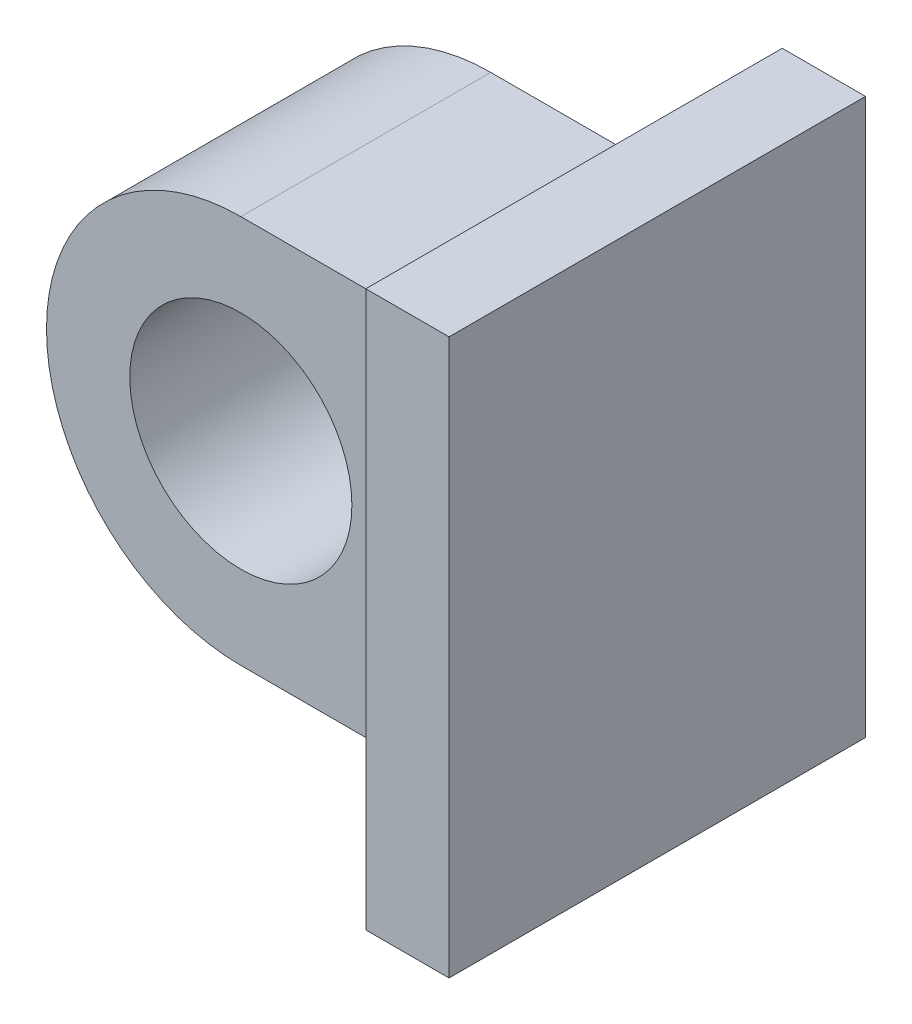
ISO-10303-21;
HEADER;
FILE_DESCRIPTION(('STEP AP214'),'2;1');
FILE_NAME('part.step','',(''),(''),'','','');
FILE_SCHEMA(('AUTOMOTIVE_DESIGN { 1 0 10303 214 1 1 1 1 }'));
ENDSEC;
DATA;
#1=APPLICATION_CONTEXT('core data for automotive mechanical design processes');
#2=APPLICATION_PROTOCOL_DEFINITION('international standard','automotive_design',2000,#1);
#3=PRODUCT_CONTEXT('',#1,'mechanical');
#4=PRODUCT('Part','Part','',(#3));
#5=PRODUCT_RELATED_PRODUCT_CATEGORY('part','',(#4));
#6=PRODUCT_DEFINITION_FORMATION('','',#4);
#7=PRODUCT_DEFINITION_CONTEXT('part definition',#1,'design');
#8=PRODUCT_DEFINITION('design','',#6,#7);
#9=PRODUCT_DEFINITION_SHAPE('','',#8);
#10=(LENGTH_UNIT() NAMED_UNIT(*) SI_UNIT(.MILLI.,.METRE.));
#11=(NAMED_UNIT(*) PLANE_ANGLE_UNIT() SI_UNIT($,.RADIAN.));
#12=(NAMED_UNIT(*) SI_UNIT($,.STERADIAN.) SOLID_ANGLE_UNIT());
#13=UNCERTAINTY_MEASURE_WITH_UNIT(LENGTH_MEASURE(1.E-05),#10,'distance_accuracy_value','');
#14=(GEOMETRIC_REPRESENTATION_CONTEXT(3) GLOBAL_UNCERTAINTY_ASSIGNED_CONTEXT((#13)) GLOBAL_UNIT_ASSIGNED_CONTEXT((#10,
#11,#12)) REPRESENTATION_CONTEXT('',''));
#15=CARTESIAN_POINT('',(0.,0.,0.));
#16=DIRECTION('',(0.,0.,1.));
#17=DIRECTION('',(1.,0.,0.));
#18=AXIS2_PLACEMENT_3D('',#15,#16,#17);
#19=CARTESIAN_POINT('',(-224.1303203288,67.1945980513491,27.6556443707464));
#20=DIRECTION('',(0.,-1.,0.));
#21=DIRECTION('',(1.,0.,0.));
#22=AXIS2_PLACEMENT_3D('',#19,#20,#21);
#23=PLANE('',#22);
#24=DIRECTION('',(0.,0.,-1.));
#25=VECTOR('',#24,1.);
#26=CARTESIAN_POINT('',(-224.1303203288,67.1945980513491,27.6556443707464));
#27=LINE('',#26,#25);
#28=CARTESIAN_POINT('',(-224.1303203288,67.1945980513491,4.5));
#29=VERTEX_POINT('',#28);
#30=CARTESIAN_POINT('',(-224.1303203288,67.1945980513491,-4.5));
#31=VERTEX_POINT('',#30);
#32=EDGE_CURVE('E143',#29,#31,#27,.T.);
#33=ORIENTED_EDGE('',*,*,#32,.T.);
#34=DIRECTION('',(1.,0.,0.));
#35=VECTOR('',#34,1.);
#36=CARTESIAN_POINT('',(-224.1303203288,67.1945980513491,-4.5));
#37=LINE('',#36,#35);
#38=CARTESIAN_POINT('',(-231.6303203288,67.1945980513491,-4.5));
#39=VERTEX_POINT('',#38);
#40=EDGE_CURVE('E118',#39,#31,#37,.T.);
#41=ORIENTED_EDGE('',*,*,#40,.F.);
#42=DIRECTION('',(0.,0.,-1.));
#43=VECTOR('',#42,1.);
#44=CARTESIAN_POINT('',(-231.6303203288,67.1945980513491,27.6556443707464));
#45=LINE('',#44,#43);
#46=CARTESIAN_POINT('',(-231.6303203288,67.1945980513491,4.5));
#47=VERTEX_POINT('',#46);
#48=EDGE_CURVE('E139',#47,#39,#45,.T.);
#49=ORIENTED_EDGE('',*,*,#48,.F.);
#50=DIRECTION('',(-1.,0.,0.));
#51=VECTOR('',#50,1.);
#52=CARTESIAN_POINT('',(-224.1303203288,67.1945980513491,4.5));
#53=LINE('',#52,#51);
#54=EDGE_CURVE('E291',#29,#47,#53,.T.);
#55=ORIENTED_EDGE('',*,*,#54,.F.);
#56=EDGE_LOOP('',(#33,#41,#49,#55));
#57=FACE_BOUND('',#56,.T.);
#58=ADVANCED_FACE('F37',(#57),#23,.F.);
#59=CARTESIAN_POINT('',(-231.6303203288,60.1945980513491,27.6556443707464));
#60=DIRECTION('',(0.,0.,-1.));
#61=DIRECTION('',(-1.,0.,0.));
#62=AXIS2_PLACEMENT_3D('',#59,#60,#61);
#63=CYLINDRICAL_SURFACE('',#62,7.00000000000002);
#64=ORIENTED_EDGE('',*,*,#48,.T.);
#65=CARTESIAN_POINT('',(-231.6303203288,60.1945980513491,-4.5));
#66=DIRECTION('',(0.,0.,-1.));
#67=DIRECTION('',(0.,-1.,0.));
#68=AXIS2_PLACEMENT_3D('',#65,#66,#67);
#69=CIRCLE('',#68,7.00000000000002);
#70=CARTESIAN_POINT('',(-231.6303203288,53.1945980513491,-4.50000000000001));
#71=VERTEX_POINT('',#70);
#72=EDGE_CURVE('E131',#71,#39,#69,.T.);
#73=ORIENTED_EDGE('',*,*,#72,.F.);
#74=DIRECTION('',(0.,0.,-1.));
#75=VECTOR('',#74,1.);
#76=CARTESIAN_POINT('',(-231.6303203288,53.1945980513491,27.6556443707464));
#77=LINE('',#76,#75);
#78=CARTESIAN_POINT('',(-231.6303203288,53.1945980513491,4.5));
#79=VERTEX_POINT('',#78);
#80=EDGE_CURVE('E130',#79,#71,#77,.T.);
#81=ORIENTED_EDGE('',*,*,#80,.F.);
#82=CARTESIAN_POINT('',(-231.6303203288,60.1945980513491,4.5));
#83=DIRECTION('',(0.,0.,1.));
#84=DIRECTION('',(1.,0.,0.));
#85=AXIS2_PLACEMENT_3D('',#82,#83,#84);
#86=CIRCLE('',#85,7.00000000000002);
#87=EDGE_CURVE('E53',#47,#79,#86,.T.);
#88=ORIENTED_EDGE('',*,*,#87,.F.);
#89=EDGE_LOOP('',(#64,#73,#81,#88));
#90=FACE_BOUND('',#89,.T.);
#91=ADVANCED_FACE('F184',(#90),#63,.T.);
#92=CARTESIAN_POINT('',(-224.1303203288,53.1945980513491,27.6556443707464));
#93=DIRECTION('',(0.,1.,0.));
#94=DIRECTION('',(-1.,0.,0.));
#95=AXIS2_PLACEMENT_3D('',#92,#93,#94);
#96=PLANE('',#95);
#97=ORIENTED_EDGE('',*,*,#80,.T.);
#98=DIRECTION('',(-1.,0.,0.));
#99=VECTOR('',#98,1.);
#100=CARTESIAN_POINT('',(-224.1303203288,53.1945980513491,-4.50000000000001));
#101=LINE('',#100,#99);
#102=CARTESIAN_POINT('',(-224.1303203288,53.1945980513491,-4.50000000000001));
#103=VERTEX_POINT('',#102);
#104=EDGE_CURVE('E115',#103,#71,#101,.T.);
#105=ORIENTED_EDGE('',*,*,#104,.F.);
#106=DIRECTION('',(0.,0.,-1.));
#107=VECTOR('',#106,1.);
#108=CARTESIAN_POINT('',(-224.1303203288,53.1945980513491,27.6556443707464));
#109=LINE('',#108,#107);
#110=CARTESIAN_POINT('',(-224.1303203288,53.1945980513491,4.5));
#111=VERTEX_POINT('',#110);
#112=EDGE_CURVE('E128',#111,#103,#109,.T.);
#113=ORIENTED_EDGE('',*,*,#112,.F.);
#114=DIRECTION('',(1.,0.,0.));
#115=VECTOR('',#114,1.);
#116=CARTESIAN_POINT('',(-224.1303203288,53.1945980513491,4.5));
#117=LINE('',#116,#115);
#118=EDGE_CURVE('E292',#79,#111,#117,.T.);
#119=ORIENTED_EDGE('',*,*,#118,.F.);
#120=EDGE_LOOP('',(#97,#105,#113,#119));
#121=FACE_BOUND('',#120,.T.);
#122=ADVANCED_FACE('F127',(#121),#96,.F.);
#123=CARTESIAN_POINT('',(-231.6303203288,60.1945980513491,27.6556443707464));
#124=DIRECTION('',(0.,0.,-1.));
#125=DIRECTION('',(-1.,0.,0.));
#126=AXIS2_PLACEMENT_3D('',#123,#124,#125);
#127=CYLINDRICAL_SURFACE('',#126,3.99999999999999);
#128=CARTESIAN_POINT('',(-231.6303203288,60.1945980513491,-4.5));
#129=DIRECTION('',(0.,0.,1.));
#130=DIRECTION('',(0.,-1.,0.));
#131=AXIS2_PLACEMENT_3D('',#128,#129,#130);
#132=CIRCLE('',#131,3.99999999999999);
#133=CARTESIAN_POINT('',(-231.6303203288,56.1945980513491,-4.5));
#134=VERTEX_POINT('',#133);
#135=EDGE_CURVE('E293',#134,#134,#132,.T.);
#136=ORIENTED_EDGE('',*,*,#135,.F.);
#137=EDGE_LOOP('',(#136));
#138=FACE_BOUND('',#137,.T.);
#139=CARTESIAN_POINT('',(-231.6303203288,60.1945980513491,4.5));
#140=DIRECTION('',(0.,0.,1.));
#141=DIRECTION('',(1.,0.,0.));
#142=AXIS2_PLACEMENT_3D('',#139,#140,#141);
#143=CIRCLE('',#142,3.99999999999999);
#144=CARTESIAN_POINT('',(-227.6303203288,60.1945980513491,4.5));
#145=VERTEX_POINT('',#144);
#146=EDGE_CURVE('E41',#145,#145,#143,.T.);
#147=ORIENTED_EDGE('',*,*,#146,.T.);
#148=EDGE_LOOP('',(#147));
#149=FACE_BOUND('',#148,.T.);
#150=ADVANCED_FACE('F194',(#138,#149),#127,.F.);
#151=CARTESIAN_POINT('',(-221.1303203288,70.1945980513491,7.5));
#152=DIRECTION('',(0.,0.,-1.));
#153=DIRECTION('',(0.,1.,0.));
#154=AXIS2_PLACEMENT_3D('',#151,#152,#153);
#155=PLANE('',#154);
#156=DIRECTION('',(0.,-1.,0.));
#157=VECTOR('',#156,1.);
#158=CARTESIAN_POINT('',(-224.1303203288,70.1945980513491,7.5));
#159=LINE('',#158,#157);
#160=CARTESIAN_POINT('',(-224.1303203288,70.1945980513491,7.5));
#161=VERTEX_POINT('',#160);
#162=CARTESIAN_POINT('',(-224.1303203288,50.1945980513491,7.5));
#163=VERTEX_POINT('',#162);
#164=EDGE_CURVE('E135',#161,#163,#159,.T.);
#165=ORIENTED_EDGE('',*,*,#164,.T.);
#166=DIRECTION('',(-1.,0.,0.));
#167=VECTOR('',#166,1.);
#168=CARTESIAN_POINT('',(-221.1303203288,50.1945980513491,7.5));
#169=LINE('',#168,#167);
#170=CARTESIAN_POINT('',(-221.1303203288,50.1945980513491,7.5));
#171=VERTEX_POINT('',#170);
#172=EDGE_CURVE('E11',#171,#163,#169,.T.);
#173=ORIENTED_EDGE('',*,*,#172,.F.);
#174=DIRECTION('',(0.,-1.,0.));
#175=VECTOR('',#174,1.);
#176=CARTESIAN_POINT('',(-221.1303203288,70.1945980513491,7.5));
#177=LINE('',#176,#175);
#178=CARTESIAN_POINT('',(-221.1303203288,70.1945980513491,7.5));
#179=VERTEX_POINT('',#178);
#180=EDGE_CURVE('E145',#179,#171,#177,.T.);
#181=ORIENTED_EDGE('',*,*,#180,.F.);
#182=DIRECTION('',(-1.,0.,0.));
#183=VECTOR('',#182,1.);
#184=CARTESIAN_POINT('',(-221.1303203288,70.1945980513491,7.5));
#185=LINE('',#184,#183);
#186=EDGE_CURVE('E150',#179,#161,#185,.T.);
#187=ORIENTED_EDGE('',*,*,#186,.T.);
#188=EDGE_LOOP('',(#165,#173,#181,#187));
#189=FACE_BOUND('',#188,.T.);
#190=ADVANCED_FACE('F39',(#189),#155,.F.);
#191=CARTESIAN_POINT('',(-221.1303203288,50.1945980513491,-7.50000000000001));
#192=DIRECTION('',(0.,1.,0.));
#193=DIRECTION('',(0.,0.,1.));
#194=AXIS2_PLACEMENT_3D('',#191,#192,#193);
#195=PLANE('',#194);
#196=DIRECTION('',(0.,0.,-1.));
#197=VECTOR('',#196,1.);
#198=CARTESIAN_POINT('',(-224.1303203288,50.1945980513491,-7.50000000000001));
#199=LINE('',#198,#197);
#200=CARTESIAN_POINT('',(-224.1303203288,50.1945980513491,-7.50000000000001));
#201=VERTEX_POINT('',#200);
#202=EDGE_CURVE('E137',#163,#201,#199,.T.);
#203=ORIENTED_EDGE('',*,*,#202,.T.);
#204=DIRECTION('',(-1.,0.,0.));
#205=VECTOR('',#204,1.);
#206=CARTESIAN_POINT('',(-221.1303203288,50.1945980513491,-7.50000000000001));
#207=LINE('',#206,#205);
#208=CARTESIAN_POINT('',(-221.1303203288,50.1945980513491,-7.50000000000001));
#209=VERTEX_POINT('',#208);
#210=EDGE_CURVE('E46',#209,#201,#207,.T.);
#211=ORIENTED_EDGE('',*,*,#210,.F.);
#212=DIRECTION('',(0.,0.,-1.));
#213=VECTOR('',#212,1.);
#214=CARTESIAN_POINT('',(-221.1303203288,50.1945980513491,-7.50000000000001));
#215=LINE('',#214,#213);
#216=EDGE_CURVE('E90',#171,#209,#215,.T.);
#217=ORIENTED_EDGE('',*,*,#216,.F.);
#218=ORIENTED_EDGE('',*,*,#172,.T.);
#219=EDGE_LOOP('',(#203,#211,#217,#218));
#220=FACE_BOUND('',#219,.T.);
#221=ADVANCED_FACE('F180',(#220),#195,.F.);
#222=CARTESIAN_POINT('',(-221.1303203288,70.1945980513491,-7.5));
#223=DIRECTION('',(0.,0.,1.));
#224=DIRECTION('',(0.,-1.,0.));
#225=AXIS2_PLACEMENT_3D('',#222,#223,#224);
#226=PLANE('',#225);
#227=DIRECTION('',(0.,1.,0.));
#228=VECTOR('',#227,1.);
#229=CARTESIAN_POINT('',(-224.1303203288,70.1945980513491,-7.5));
#230=LINE('',#229,#228);
#231=CARTESIAN_POINT('',(-224.1303203288,70.1945980513491,-7.5));
#232=VERTEX_POINT('',#231);
#233=EDGE_CURVE('E153',#201,#232,#230,.T.);
#234=ORIENTED_EDGE('',*,*,#233,.T.);
#235=DIRECTION('',(-1.,0.,0.));
#236=VECTOR('',#235,1.);
#237=CARTESIAN_POINT('',(-221.1303203288,70.1945980513491,-7.5));
#238=LINE('',#237,#236);
#239=CARTESIAN_POINT('',(-221.1303203288,70.1945980513491,-7.5));
#240=VERTEX_POINT('',#239);
#241=EDGE_CURVE('E157',#240,#232,#238,.T.);
#242=ORIENTED_EDGE('',*,*,#241,.F.);
#243=DIRECTION('',(0.,1.,0.));
#244=VECTOR('',#243,1.);
#245=CARTESIAN_POINT('',(-221.1303203288,70.1945980513491,-7.5));
#246=LINE('',#245,#244);
#247=EDGE_CURVE('E148',#209,#240,#246,.T.);
#248=ORIENTED_EDGE('',*,*,#247,.F.);
#249=ORIENTED_EDGE('',*,*,#210,.T.);
#250=EDGE_LOOP('',(#234,#242,#248,#249));
#251=FACE_BOUND('',#250,.T.);
#252=ADVANCED_FACE('F163',(#251),#226,.F.);
#253=CARTESIAN_POINT('',(-221.1303203288,70.1945980513491,-7.5));
#254=DIRECTION('',(0.,-1.,0.));
#255=DIRECTION('',(0.,0.,-1.));
#256=AXIS2_PLACEMENT_3D('',#253,#254,#255);
#257=PLANE('',#256);
#258=DIRECTION('',(0.,0.,1.));
#259=VECTOR('',#258,1.);
#260=CARTESIAN_POINT('',(-224.1303203288,70.1945980513491,-7.5));
#261=LINE('',#260,#259);
#262=EDGE_CURVE('E83',#232,#161,#261,.T.);
#263=ORIENTED_EDGE('',*,*,#262,.T.);
#264=ORIENTED_EDGE('',*,*,#186,.F.);
#265=DIRECTION('',(0.,0.,1.));
#266=VECTOR('',#265,1.);
#267=CARTESIAN_POINT('',(-221.1303203288,70.1945980513491,-7.5));
#268=LINE('',#267,#266);
#269=EDGE_CURVE('E62',#240,#179,#268,.T.);
#270=ORIENTED_EDGE('',*,*,#269,.F.);
#271=ORIENTED_EDGE('',*,*,#241,.T.);
#272=EDGE_LOOP('',(#263,#264,#270,#271));
#273=FACE_BOUND('',#272,.T.);
#274=ADVANCED_FACE('F171',(#273),#257,.F.);
#275=CARTESIAN_POINT('',(-221.1303203288,0.,0.));
#276=DIRECTION('',(-1.,0.,0.));
#277=DIRECTION('',(0.,0.,1.));
#278=AXIS2_PLACEMENT_3D('',#275,#276,#277);
#279=PLANE('',#278);
#280=ORIENTED_EDGE('',*,*,#180,.T.);
#281=ORIENTED_EDGE('',*,*,#216,.T.);
#282=ORIENTED_EDGE('',*,*,#247,.T.);
#283=ORIENTED_EDGE('',*,*,#269,.T.);
#284=EDGE_LOOP('',(#280,#281,#282,#283));
#285=FACE_BOUND('',#284,.T.);
#286=ADVANCED_FACE('F173',(#285),#279,.F.);
#287=CARTESIAN_POINT('',(-224.1303203288,0.,0.));
#288=DIRECTION('',(-1.,0.,0.));
#289=DIRECTION('',(0.,0.,1.));
#290=AXIS2_PLACEMENT_3D('',#287,#288,#289);
#291=PLANE('',#290);
#292=ORIENTED_EDGE('',*,*,#262,.F.);
#293=ORIENTED_EDGE('',*,*,#233,.F.);
#294=ORIENTED_EDGE('',*,*,#202,.F.);
#295=ORIENTED_EDGE('',*,*,#164,.F.);
#296=EDGE_LOOP('',(#292,#293,#294,#295));
#297=FACE_BOUND('',#296,.T.);
#298=ORIENTED_EDGE('',*,*,#32,.F.);
#299=DIRECTION('',(0.,1.,0.));
#300=VECTOR('',#299,1.);
#301=CARTESIAN_POINT('',(-224.1303203288,67.1945980513491,4.5));
#302=LINE('',#301,#300);
#303=EDGE_CURVE('E134',#111,#29,#302,.T.);
#304=ORIENTED_EDGE('',*,*,#303,.F.);
#305=ORIENTED_EDGE('',*,*,#112,.T.);
#306=DIRECTION('',(0.,-1.,0.));
#307=VECTOR('',#306,1.);
#308=CARTESIAN_POINT('',(-224.1303203288,67.1945980513491,-4.5));
#309=LINE('',#308,#307);
#310=EDGE_CURVE('E112',#31,#103,#309,.T.);
#311=ORIENTED_EDGE('',*,*,#310,.F.);
#312=EDGE_LOOP('',(#298,#304,#305,#311));
#313=FACE_BOUND('',#312,.T.);
#314=ADVANCED_FACE('F133',(#297,#313),#291,.T.);
#315=CARTESIAN_POINT('',(-231.6303203288,60.1945980513491,4.5));
#316=DIRECTION('',(0.,0.,1.));
#317=DIRECTION('',(1.,0.,0.));
#318=AXIS2_PLACEMENT_3D('',#315,#316,#317);
#319=PLANE('',#318);
#320=ORIENTED_EDGE('',*,*,#146,.F.);
#321=EDGE_LOOP('',(#320));
#322=FACE_BOUND('',#321,.T.);
#323=ORIENTED_EDGE('',*,*,#303,.T.);
#324=ORIENTED_EDGE('',*,*,#54,.T.);
#325=ORIENTED_EDGE('',*,*,#87,.T.);
#326=ORIENTED_EDGE('',*,*,#118,.T.);
#327=EDGE_LOOP('',(#323,#324,#325,#326));
#328=FACE_BOUND('',#327,.T.);
#329=ADVANCED_FACE('F198',(#322,#328),#319,.T.);
#330=CARTESIAN_POINT('',(-231.6303203288,60.1945980513491,-4.5));
#331=DIRECTION('',(0.,0.,1.));
#332=DIRECTION('',(0.,-1.,0.));
#333=AXIS2_PLACEMENT_3D('',#330,#331,#332);
#334=PLANE('',#333);
#335=ORIENTED_EDGE('',*,*,#135,.T.);
#336=EDGE_LOOP('',(#335));
#337=FACE_BOUND('',#336,.T.);
#338=ORIENTED_EDGE('',*,*,#310,.T.);
#339=ORIENTED_EDGE('',*,*,#104,.T.);
#340=ORIENTED_EDGE('',*,*,#72,.T.);
#341=ORIENTED_EDGE('',*,*,#40,.T.);
#342=EDGE_LOOP('',(#338,#339,#340,#341));
#343=FACE_BOUND('',#342,.T.);
#344=ADVANCED_FACE('F114',(#337,#343),#334,.F.);
#345=CLOSED_SHELL('',(#58,#91,#122,#150,#190,#221,#252,#274,#286,#314,#329,#344));
#346=MANIFOLD_SOLID_BREP('B2',#345);
#347=ADVANCED_BREP_SHAPE_REPRESENTATION('',(#18,#346),#14);
#348=SHAPE_DEFINITION_REPRESENTATION(#9,#347);
ENDSEC;
END-ISO-10303-21;
